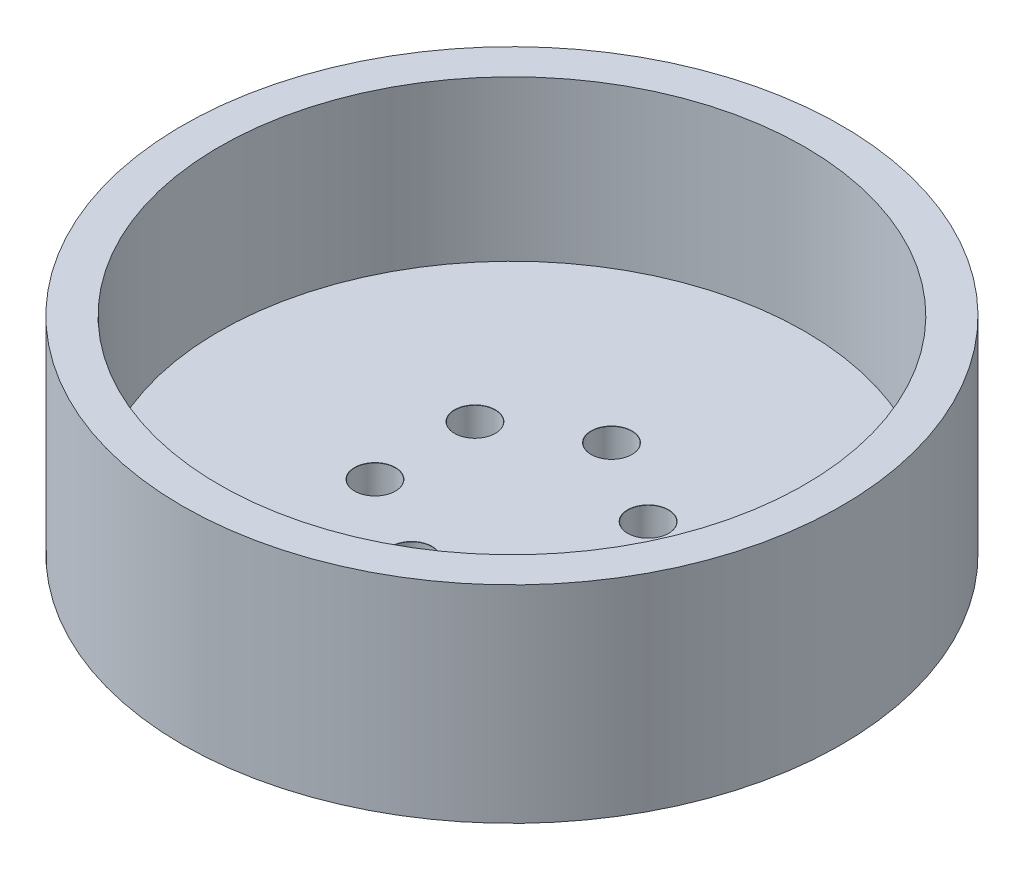
ISO-10303-21;
HEADER;
FILE_DESCRIPTION(('STEP AP214'),'2;1');
FILE_NAME('part.step','',(''),(''),'','','');
FILE_SCHEMA(('AUTOMOTIVE_DESIGN { 1 0 10303 214 1 1 1 1 }'));
ENDSEC;
DATA;
#1=APPLICATION_CONTEXT('core data for automotive mechanical design processes');
#2=APPLICATION_PROTOCOL_DEFINITION('international standard','automotive_design',2000,#1);
#3=PRODUCT_CONTEXT('',#1,'mechanical');
#4=PRODUCT('Part','Part','',(#3));
#5=PRODUCT_RELATED_PRODUCT_CATEGORY('part','',(#4));
#6=PRODUCT_DEFINITION_FORMATION('','',#4);
#7=PRODUCT_DEFINITION_CONTEXT('part definition',#1,'design');
#8=PRODUCT_DEFINITION('design','',#6,#7);
#9=PRODUCT_DEFINITION_SHAPE('','',#8);
#10=(LENGTH_UNIT() NAMED_UNIT(*) SI_UNIT(.MILLI.,.METRE.));
#11=(NAMED_UNIT(*) PLANE_ANGLE_UNIT() SI_UNIT($,.RADIAN.));
#12=(NAMED_UNIT(*) SI_UNIT($,.STERADIAN.) SOLID_ANGLE_UNIT());
#13=UNCERTAINTY_MEASURE_WITH_UNIT(LENGTH_MEASURE(1.E-05),#10,'distance_accuracy_value','');
#14=(GEOMETRIC_REPRESENTATION_CONTEXT(3) GLOBAL_UNCERTAINTY_ASSIGNED_CONTEXT((#13)) GLOBAL_UNIT_ASSIGNED_CONTEXT((#10,
#11,#12)) REPRESENTATION_CONTEXT('',''));
#15=CARTESIAN_POINT('',(0.,0.,0.));
#16=DIRECTION('',(0.,0.,1.));
#17=DIRECTION('',(1.,0.,0.));
#18=AXIS2_PLACEMENT_3D('',#15,#16,#17);
#19=CARTESIAN_POINT('',(0.,6.35,0.));
#20=DIRECTION('',(0.,-1.,0.));
#21=DIRECTION('',(0.,0.,-1.));
#22=AXIS2_PLACEMENT_3D('',#19,#20,#21);
#23=CYLINDRICAL_SURFACE('',#22,44.675);
#24=CARTESIAN_POINT('',(0.,0.,0.));
#25=DIRECTION('',(0.,1.,0.));
#26=DIRECTION('',(0.,0.,1.));
#27=AXIS2_PLACEMENT_3D('',#24,#25,#26);
#28=CIRCLE('',#27,44.675);
#29=CARTESIAN_POINT('',(0.,0.,44.675));
#30=VERTEX_POINT('',#29);
#31=EDGE_CURVE('E47',#30,#30,#28,.T.);
#32=ORIENTED_EDGE('',*,*,#31,.T.);
#33=EDGE_LOOP('',(#32));
#34=FACE_BOUND('',#33,.T.);
#35=CARTESIAN_POINT('',(0.,28.,0.));
#36=DIRECTION('',(0.,1.,0.));
#37=DIRECTION('',(0.,0.,1.));
#38=AXIS2_PLACEMENT_3D('',#35,#36,#37);
#39=CIRCLE('',#38,44.675);
#40=CARTESIAN_POINT('',(0.,28.,44.675));
#41=VERTEX_POINT('',#40);
#42=EDGE_CURVE('E108',#41,#41,#39,.T.);
#43=ORIENTED_EDGE('',*,*,#42,.F.);
#44=EDGE_LOOP('',(#43));
#45=FACE_BOUND('',#44,.T.);
#46=ADVANCED_FACE('F41',(#34,#45),#23,.T.);
#47=CARTESIAN_POINT('',(0.,6.35,0.));
#48=DIRECTION('',(0.,1.,0.));
#49=DIRECTION('',(0.,0.,1.));
#50=AXIS2_PLACEMENT_3D('',#47,#48,#49);
#51=PLANE('',#50);
#52=CARTESIAN_POINT('',(0.,6.35,0.));
#53=DIRECTION('',(0.,1.,0.));
#54=DIRECTION('',(0.,0.,1.));
#55=AXIS2_PLACEMENT_3D('',#52,#53,#54);
#56=CIRCLE('',#55,39.675);
#57=CARTESIAN_POINT('',(0.,6.35,-39.675));
#58=VERTEX_POINT('',#57);
#59=EDGE_CURVE('E10',#58,#58,#56,.F.);
#60=ORIENTED_EDGE('',*,*,#59,.F.);
#61=EDGE_LOOP('',(#60));
#62=FACE_BOUND('',#61,.T.);
#63=CARTESIAN_POINT('',(11.7366264666169,6.35,-6.72385555012073));
#64=DIRECTION('',(0.,1.,0.));
#65=DIRECTION('',(0.,0.,1.));
#66=AXIS2_PLACEMENT_3D('',#63,#64,#65);
#67=CIRCLE('',#66,2.775);
#68=CARTESIAN_POINT('',(11.7366264666169,6.35,-3.94885555012073));
#69=VERTEX_POINT('',#68);
#70=EDGE_CURVE('E105',#69,#69,#67,.T.);
#71=ORIENTED_EDGE('',*,*,#70,.F.);
#72=EDGE_LOOP('',(#71));
#73=FACE_BOUND('',#72,.T.);
#74=CARTESIAN_POINT('',(11.7366264666171,6.35,6.82843334963811));
#75=DIRECTION('',(0.,1.,0.));
#76=DIRECTION('',(0.,0.,1.));
#77=AXIS2_PLACEMENT_3D('',#74,#75,#76);
#78=CIRCLE('',#77,2.775);
#79=CARTESIAN_POINT('',(11.7366264666171,6.35,9.60343334963811));
#80=VERTEX_POINT('',#79);
#81=EDGE_CURVE('E96',#80,#80,#78,.T.);
#82=ORIENTED_EDGE('',*,*,#81,.F.);
#83=EDGE_LOOP('',(#82));
#84=FACE_BOUND('',#83,.T.);
#85=CARTESIAN_POINT('',(0.,6.35,13.6045777995176));
#86=DIRECTION('',(0.,1.,0.));
#87=DIRECTION('',(0.,0.,1.));
#88=AXIS2_PLACEMENT_3D('',#85,#86,#87);
#89=CIRCLE('',#88,2.775);
#90=CARTESIAN_POINT('',(0.,6.35,16.3795777995176));
#91=VERTEX_POINT('',#90);
#92=EDGE_CURVE('E87',#91,#91,#89,.T.);
#93=ORIENTED_EDGE('',*,*,#92,.F.);
#94=EDGE_LOOP('',(#93));
#95=FACE_BOUND('',#94,.T.);
#96=CARTESIAN_POINT('',(-11.736626466617,6.35,6.82843334963828));
#97=DIRECTION('',(0.,1.,0.));
#98=DIRECTION('',(0.,0.,1.));
#99=AXIS2_PLACEMENT_3D('',#96,#97,#98);
#100=CIRCLE('',#99,2.775);
#101=CARTESIAN_POINT('',(-11.736626466617,6.35,9.60343334963827));
#102=VERTEX_POINT('',#101);
#103=EDGE_CURVE('E78',#102,#102,#100,.T.);
#104=ORIENTED_EDGE('',*,*,#103,.F.);
#105=EDGE_LOOP('',(#104));
#106=FACE_BOUND('',#105,.T.);
#107=CARTESIAN_POINT('',(-11.736626466617,6.35,-6.72385555012057));
#108=DIRECTION('',(0.,1.,0.));
#109=DIRECTION('',(0.,0.,1.));
#110=AXIS2_PLACEMENT_3D('',#107,#108,#109);
#111=CIRCLE('',#110,2.775);
#112=CARTESIAN_POINT('',(-11.736626466617,6.35,-3.94885555012057));
#113=VERTEX_POINT('',#112);
#114=EDGE_CURVE('E69',#113,#113,#111,.T.);
#115=ORIENTED_EDGE('',*,*,#114,.F.);
#116=EDGE_LOOP('',(#115));
#117=FACE_BOUND('',#116,.T.);
#118=CARTESIAN_POINT('',(0.,6.35,-13.5));
#119=DIRECTION('',(0.,1.,0.));
#120=DIRECTION('',(0.,0.,1.));
#121=AXIS2_PLACEMENT_3D('',#118,#119,#120);
#122=CIRCLE('',#121,2.775);
#123=CARTESIAN_POINT('',(0.,6.35,-10.725));
#124=VERTEX_POINT('',#123);
#125=EDGE_CURVE('E60',#124,#124,#122,.T.);
#126=ORIENTED_EDGE('',*,*,#125,.F.);
#127=EDGE_LOOP('',(#126));
#128=FACE_BOUND('',#127,.T.);
#129=ADVANCED_FACE('F124',(#62,#73,#84,#95,#106,#117,#128),#51,.T.);
#130=CARTESIAN_POINT('',(0.,0.,0.));
#131=DIRECTION('',(0.,1.,0.));
#132=DIRECTION('',(0.,0.,1.));
#133=AXIS2_PLACEMENT_3D('',#130,#131,#132);
#134=PLANE('',#133);
#135=CARTESIAN_POINT('',(11.7366264666169,0.,-6.72385555012073));
#136=DIRECTION('',(0.,1.,0.));
#137=DIRECTION('',(0.,0.,1.));
#138=AXIS2_PLACEMENT_3D('',#135,#136,#137);
#139=CIRCLE('',#138,2.75);
#140=CARTESIAN_POINT('',(11.7366264666169,0.,-3.97385555012073));
#141=VERTEX_POINT('',#140);
#142=EDGE_CURVE('E99',#141,#141,#139,.T.);
#143=ORIENTED_EDGE('',*,*,#142,.T.);
#144=EDGE_LOOP('',(#143));
#145=FACE_BOUND('',#144,.T.);
#146=CARTESIAN_POINT('',(11.7366264666171,0.,6.82843334963811));
#147=DIRECTION('',(0.,1.,0.));
#148=DIRECTION('',(0.,0.,1.));
#149=AXIS2_PLACEMENT_3D('',#146,#147,#148);
#150=CIRCLE('',#149,2.75);
#151=CARTESIAN_POINT('',(11.7366264666171,0.,9.57843334963811));
#152=VERTEX_POINT('',#151);
#153=EDGE_CURVE('E90',#152,#152,#150,.T.);
#154=ORIENTED_EDGE('',*,*,#153,.T.);
#155=EDGE_LOOP('',(#154));
#156=FACE_BOUND('',#155,.T.);
#157=CARTESIAN_POINT('',(0.,0.,13.6045777995176));
#158=DIRECTION('',(0.,1.,0.));
#159=DIRECTION('',(0.,0.,1.));
#160=AXIS2_PLACEMENT_3D('',#157,#158,#159);
#161=CIRCLE('',#160,2.75);
#162=CARTESIAN_POINT('',(0.,0.,16.3545777995176));
#163=VERTEX_POINT('',#162);
#164=EDGE_CURVE('E81',#163,#163,#161,.T.);
#165=ORIENTED_EDGE('',*,*,#164,.T.);
#166=EDGE_LOOP('',(#165));
#167=FACE_BOUND('',#166,.T.);
#168=CARTESIAN_POINT('',(-11.736626466617,0.,6.82843334963828));
#169=DIRECTION('',(0.,1.,0.));
#170=DIRECTION('',(0.,0.,1.));
#171=AXIS2_PLACEMENT_3D('',#168,#169,#170);
#172=CIRCLE('',#171,2.75);
#173=CARTESIAN_POINT('',(-11.736626466617,0.,9.57843334963827));
#174=VERTEX_POINT('',#173);
#175=EDGE_CURVE('E72',#174,#174,#172,.T.);
#176=ORIENTED_EDGE('',*,*,#175,.T.);
#177=EDGE_LOOP('',(#176));
#178=FACE_BOUND('',#177,.T.);
#179=CARTESIAN_POINT('',(-11.736626466617,0.,-6.72385555012057));
#180=DIRECTION('',(0.,1.,0.));
#181=DIRECTION('',(0.,0.,1.));
#182=AXIS2_PLACEMENT_3D('',#179,#180,#181);
#183=CIRCLE('',#182,2.75);
#184=CARTESIAN_POINT('',(-11.736626466617,0.,-3.97385555012057));
#185=VERTEX_POINT('',#184);
#186=EDGE_CURVE('E63',#185,#185,#183,.T.);
#187=ORIENTED_EDGE('',*,*,#186,.T.);
#188=EDGE_LOOP('',(#187));
#189=FACE_BOUND('',#188,.T.);
#190=CARTESIAN_POINT('',(0.,0.,-13.5));
#191=DIRECTION('',(0.,1.,0.));
#192=DIRECTION('',(0.,0.,1.));
#193=AXIS2_PLACEMENT_3D('',#190,#191,#192);
#194=CIRCLE('',#193,2.75);
#195=CARTESIAN_POINT('',(0.,0.,-10.75));
#196=VERTEX_POINT('',#195);
#197=EDGE_CURVE('E51',#196,#196,#194,.T.);
#198=ORIENTED_EDGE('',*,*,#197,.T.);
#199=EDGE_LOOP('',(#198));
#200=FACE_BOUND('',#199,.T.);
#201=ORIENTED_EDGE('',*,*,#31,.F.);
#202=EDGE_LOOP('',(#201));
#203=FACE_BOUND('',#202,.T.);
#204=ADVANCED_FACE('F130',(#145,#156,#167,#178,#189,#200,#203),#134,.F.);
#205=CARTESIAN_POINT('',(0.,6.35,-13.5));
#206=DIRECTION('',(0.,1.,0.));
#207=DIRECTION('',(0.,0.,1.));
#208=AXIS2_PLACEMENT_3D('',#205,#206,#207);
#209=CYLINDRICAL_SURFACE('',#208,2.74999999999999);
#210=ORIENTED_EDGE('',*,*,#197,.F.);
#211=EDGE_LOOP('',(#210));
#212=FACE_BOUND('',#211,.T.);
#213=CARTESIAN_POINT('',(0.,6.325,-13.5));
#214=DIRECTION('',(0.,1.,0.));
#215=DIRECTION('',(0.,0.,1.));
#216=AXIS2_PLACEMENT_3D('',#213,#214,#215);
#217=CIRCLE('',#216,2.74999999999999);
#218=CARTESIAN_POINT('',(0.,6.325,-10.75));
#219=VERTEX_POINT('',#218);
#220=EDGE_CURVE('E55',#219,#219,#217,.T.);
#221=ORIENTED_EDGE('',*,*,#220,.T.);
#222=EDGE_LOOP('',(#221));
#223=FACE_BOUND('',#222,.T.);
#224=ADVANCED_FACE('F136',(#212,#223),#209,.F.);
#225=CARTESIAN_POINT('',(0.,6.35,-13.5));
#226=DIRECTION('',(0.,1.,0.));
#227=DIRECTION('',(0.,0.,1.));
#228=AXIS2_PLACEMENT_3D('',#225,#226,#227);
#229=CONICAL_SURFACE('',#228,2.775,0.785398163397691);
#230=ORIENTED_EDGE('',*,*,#220,.F.);
#231=EDGE_LOOP('',(#230));
#232=FACE_BOUND('',#231,.T.);
#233=ORIENTED_EDGE('',*,*,#125,.T.);
#234=EDGE_LOOP('',(#233));
#235=FACE_BOUND('',#234,.T.);
#236=ADVANCED_FACE('F142',(#232,#235),#229,.F.);
#237=CARTESIAN_POINT('',(-11.736626466617,6.35,-6.72385555012057));
#238=DIRECTION('',(0.,1.,0.));
#239=DIRECTION('',(0.,0.,1.));
#240=AXIS2_PLACEMENT_3D('',#237,#238,#239);
#241=CYLINDRICAL_SURFACE('',#240,2.74999999999999);
#242=ORIENTED_EDGE('',*,*,#186,.F.);
#243=EDGE_LOOP('',(#242));
#244=FACE_BOUND('',#243,.T.);
#245=CARTESIAN_POINT('',(-11.736626466617,6.325,-6.72385555012057));
#246=DIRECTION('',(0.,1.,0.));
#247=DIRECTION('',(0.,0.,1.));
#248=AXIS2_PLACEMENT_3D('',#245,#246,#247);
#249=CIRCLE('',#248,2.74999999999999);
#250=CARTESIAN_POINT('',(-11.736626466617,6.325,-3.97385555012058));
#251=VERTEX_POINT('',#250);
#252=EDGE_CURVE('E66',#251,#251,#249,.T.);
#253=ORIENTED_EDGE('',*,*,#252,.T.);
#254=EDGE_LOOP('',(#253));
#255=FACE_BOUND('',#254,.T.);
#256=ADVANCED_FACE('F146',(#244,#255),#241,.F.);
#257=CARTESIAN_POINT('',(-11.736626466617,6.35,-6.72385555012057));
#258=DIRECTION('',(0.,1.,0.));
#259=DIRECTION('',(0.,0.,1.));
#260=AXIS2_PLACEMENT_3D('',#257,#258,#259);
#261=CONICAL_SURFACE('',#260,2.775,0.785398163397691);
#262=ORIENTED_EDGE('',*,*,#252,.F.);
#263=EDGE_LOOP('',(#262));
#264=FACE_BOUND('',#263,.T.);
#265=ORIENTED_EDGE('',*,*,#114,.T.);
#266=EDGE_LOOP('',(#265));
#267=FACE_BOUND('',#266,.T.);
#268=ADVANCED_FACE('F150',(#264,#267),#261,.F.);
#269=CARTESIAN_POINT('',(-11.736626466617,6.35,6.82843334963828));
#270=DIRECTION('',(0.,1.,0.));
#271=DIRECTION('',(0.,0.,1.));
#272=AXIS2_PLACEMENT_3D('',#269,#270,#271);
#273=CYLINDRICAL_SURFACE('',#272,2.74999999999999);
#274=ORIENTED_EDGE('',*,*,#175,.F.);
#275=EDGE_LOOP('',(#274));
#276=FACE_BOUND('',#275,.T.);
#277=CARTESIAN_POINT('',(-11.736626466617,6.325,6.82843334963828));
#278=DIRECTION('',(0.,1.,0.));
#279=DIRECTION('',(0.,0.,1.));
#280=AXIS2_PLACEMENT_3D('',#277,#278,#279);
#281=CIRCLE('',#280,2.74999999999999);
#282=CARTESIAN_POINT('',(-11.736626466617,6.325,9.57843334963826));
#283=VERTEX_POINT('',#282);
#284=EDGE_CURVE('E75',#283,#283,#281,.T.);
#285=ORIENTED_EDGE('',*,*,#284,.T.);
#286=EDGE_LOOP('',(#285));
#287=FACE_BOUND('',#286,.T.);
#288=ADVANCED_FACE('F154',(#276,#287),#273,.F.);
#289=CARTESIAN_POINT('',(-11.736626466617,6.35,6.82843334963828));
#290=DIRECTION('',(0.,1.,0.));
#291=DIRECTION('',(0.,0.,1.));
#292=AXIS2_PLACEMENT_3D('',#289,#290,#291);
#293=CONICAL_SURFACE('',#292,2.775,0.785398163397691);
#294=ORIENTED_EDGE('',*,*,#284,.F.);
#295=EDGE_LOOP('',(#294));
#296=FACE_BOUND('',#295,.T.);
#297=ORIENTED_EDGE('',*,*,#103,.T.);
#298=EDGE_LOOP('',(#297));
#299=FACE_BOUND('',#298,.T.);
#300=ADVANCED_FACE('F158',(#296,#299),#293,.F.);
#301=CARTESIAN_POINT('',(0.,6.35,13.6045777995176));
#302=DIRECTION('',(0.,1.,0.));
#303=DIRECTION('',(0.,0.,1.));
#304=AXIS2_PLACEMENT_3D('',#301,#302,#303);
#305=CYLINDRICAL_SURFACE('',#304,2.74999999999999);
#306=ORIENTED_EDGE('',*,*,#164,.F.);
#307=EDGE_LOOP('',(#306));
#308=FACE_BOUND('',#307,.T.);
#309=CARTESIAN_POINT('',(0.,6.325,13.6045777995176));
#310=DIRECTION('',(0.,1.,0.));
#311=DIRECTION('',(0.,0.,1.));
#312=AXIS2_PLACEMENT_3D('',#309,#310,#311);
#313=CIRCLE('',#312,2.74999999999999);
#314=CARTESIAN_POINT('',(0.,6.325,16.3545777995176));
#315=VERTEX_POINT('',#314);
#316=EDGE_CURVE('E84',#315,#315,#313,.T.);
#317=ORIENTED_EDGE('',*,*,#316,.T.);
#318=EDGE_LOOP('',(#317));
#319=FACE_BOUND('',#318,.T.);
#320=ADVANCED_FACE('F162',(#308,#319),#305,.F.);
#321=CARTESIAN_POINT('',(0.,6.35,13.6045777995176));
#322=DIRECTION('',(0.,1.,0.));
#323=DIRECTION('',(0.,0.,1.));
#324=AXIS2_PLACEMENT_3D('',#321,#322,#323);
#325=CONICAL_SURFACE('',#324,2.775,0.785398163397691);
#326=ORIENTED_EDGE('',*,*,#316,.F.);
#327=EDGE_LOOP('',(#326));
#328=FACE_BOUND('',#327,.T.);
#329=ORIENTED_EDGE('',*,*,#92,.T.);
#330=EDGE_LOOP('',(#329));
#331=FACE_BOUND('',#330,.T.);
#332=ADVANCED_FACE('F166',(#328,#331),#325,.F.);
#333=CARTESIAN_POINT('',(11.7366264666171,6.35,6.82843334963811));
#334=DIRECTION('',(0.,1.,0.));
#335=DIRECTION('',(0.,0.,1.));
#336=AXIS2_PLACEMENT_3D('',#333,#334,#335);
#337=CYLINDRICAL_SURFACE('',#336,2.74999999999999);
#338=ORIENTED_EDGE('',*,*,#153,.F.);
#339=EDGE_LOOP('',(#338));
#340=FACE_BOUND('',#339,.T.);
#341=CARTESIAN_POINT('',(11.7366264666171,6.325,6.82843334963811));
#342=DIRECTION('',(0.,1.,0.));
#343=DIRECTION('',(0.,0.,1.));
#344=AXIS2_PLACEMENT_3D('',#341,#342,#343);
#345=CIRCLE('',#344,2.74999999999999);
#346=CARTESIAN_POINT('',(11.7366264666171,6.325,9.5784333496381));
#347=VERTEX_POINT('',#346);
#348=EDGE_CURVE('E93',#347,#347,#345,.T.);
#349=ORIENTED_EDGE('',*,*,#348,.T.);
#350=EDGE_LOOP('',(#349));
#351=FACE_BOUND('',#350,.T.);
#352=ADVANCED_FACE('F170',(#340,#351),#337,.F.);
#353=CARTESIAN_POINT('',(11.7366264666171,6.35,6.82843334963811));
#354=DIRECTION('',(0.,1.,0.));
#355=DIRECTION('',(0.,0.,1.));
#356=AXIS2_PLACEMENT_3D('',#353,#354,#355);
#357=CONICAL_SURFACE('',#356,2.775,0.785398163397691);
#358=ORIENTED_EDGE('',*,*,#348,.F.);
#359=EDGE_LOOP('',(#358));
#360=FACE_BOUND('',#359,.T.);
#361=ORIENTED_EDGE('',*,*,#81,.T.);
#362=EDGE_LOOP('',(#361));
#363=FACE_BOUND('',#362,.T.);
#364=ADVANCED_FACE('F174',(#360,#363),#357,.F.);
#365=CARTESIAN_POINT('',(11.7366264666169,6.35,-6.72385555012073));
#366=DIRECTION('',(0.,1.,0.));
#367=DIRECTION('',(0.,0.,1.));
#368=AXIS2_PLACEMENT_3D('',#365,#366,#367);
#369=CYLINDRICAL_SURFACE('',#368,2.74999999999999);
#370=ORIENTED_EDGE('',*,*,#142,.F.);
#371=EDGE_LOOP('',(#370));
#372=FACE_BOUND('',#371,.T.);
#373=CARTESIAN_POINT('',(11.7366264666169,6.325,-6.72385555012073));
#374=DIRECTION('',(0.,1.,0.));
#375=DIRECTION('',(0.,0.,1.));
#376=AXIS2_PLACEMENT_3D('',#373,#374,#375);
#377=CIRCLE('',#376,2.74999999999999);
#378=CARTESIAN_POINT('',(11.7366264666169,6.325,-3.97385555012074));
#379=VERTEX_POINT('',#378);
#380=EDGE_CURVE('E102',#379,#379,#377,.T.);
#381=ORIENTED_EDGE('',*,*,#380,.T.);
#382=EDGE_LOOP('',(#381));
#383=FACE_BOUND('',#382,.T.);
#384=ADVANCED_FACE('F178',(#372,#383),#369,.F.);
#385=CARTESIAN_POINT('',(11.7366264666169,6.35,-6.72385555012073));
#386=DIRECTION('',(0.,1.,0.));
#387=DIRECTION('',(0.,0.,1.));
#388=AXIS2_PLACEMENT_3D('',#385,#386,#387);
#389=CONICAL_SURFACE('',#388,2.775,0.785398163397691);
#390=ORIENTED_EDGE('',*,*,#380,.F.);
#391=EDGE_LOOP('',(#390));
#392=FACE_BOUND('',#391,.T.);
#393=ORIENTED_EDGE('',*,*,#70,.T.);
#394=EDGE_LOOP('',(#393));
#395=FACE_BOUND('',#394,.T.);
#396=ADVANCED_FACE('F181',(#392,#395),#389,.F.);
#397=CARTESIAN_POINT('',(0.,28.,0.));
#398=DIRECTION('',(0.,-1.,0.));
#399=DIRECTION('',(0.,0.,-1.));
#400=AXIS2_PLACEMENT_3D('',#397,#398,#399);
#401=CYLINDRICAL_SURFACE('',#400,39.675);
#402=CARTESIAN_POINT('',(0.,28.,0.));
#403=DIRECTION('',(0.,1.,0.));
#404=DIRECTION('',(0.,0.,1.));
#405=AXIS2_PLACEMENT_3D('',#402,#403,#404);
#406=CIRCLE('',#405,39.675);
#407=CARTESIAN_POINT('',(0.,28.,-39.675));
#408=VERTEX_POINT('',#407);
#409=EDGE_CURVE('E111',#408,#408,#406,.T.);
#410=CARTESIAN_POINT('',(0.,28.,-39.675));
#411=CARTESIAN_POINT('',(0.,27.7744791666667,-39.675));
#412=CARTESIAN_POINT('',(0.,27.5489583333333,-39.675));
#413=CARTESIAN_POINT('',(0.,27.0979166666667,-39.675));
#414=CARTESIAN_POINT('',(0.,26.8723958333333,-39.675));
#415=CARTESIAN_POINT('',(0.,26.4213541666667,-39.675));
#416=CARTESIAN_POINT('',(0.,26.1958333333333,-39.675));
#417=CARTESIAN_POINT('',(0.,25.7447916666667,-39.675));
#418=CARTESIAN_POINT('',(0.,25.5192708333333,-39.675));
#419=CARTESIAN_POINT('',(0.,25.0682291666667,-39.675));
#420=CARTESIAN_POINT('',(0.,24.8427083333333,-39.675));
#421=CARTESIAN_POINT('',(0.,24.3916666666667,-39.675));
#422=CARTESIAN_POINT('',(0.,24.1661458333333,-39.675));
#423=CARTESIAN_POINT('',(0.,23.7151041666667,-39.675));
#424=CARTESIAN_POINT('',(0.,23.4895833333333,-39.675));
#425=CARTESIAN_POINT('',(0.,23.0385416666667,-39.675));
#426=CARTESIAN_POINT('',(0.,22.8130208333333,-39.675));
#427=CARTESIAN_POINT('',(0.,22.3619791666667,-39.675));
#428=CARTESIAN_POINT('',(0.,22.1364583333333,-39.675));
#429=CARTESIAN_POINT('',(0.,21.6854166666667,-39.675));
#430=CARTESIAN_POINT('',(0.,21.4598958333333,-39.675));
#431=CARTESIAN_POINT('',(0.,21.0088541666667,-39.675));
#432=CARTESIAN_POINT('',(0.,20.7833333333333,-39.675));
#433=CARTESIAN_POINT('',(0.,20.3322916666667,-39.675));
#434=CARTESIAN_POINT('',(0.,20.1067708333333,-39.675));
#435=CARTESIAN_POINT('',(0.,19.6557291666667,-39.675));
#436=CARTESIAN_POINT('',(0.,19.4302083333333,-39.675));
#437=CARTESIAN_POINT('',(0.,18.9791666666667,-39.675));
#438=CARTESIAN_POINT('',(0.,18.7536458333333,-39.675));
#439=CARTESIAN_POINT('',(0.,18.3026041666667,-39.675));
#440=CARTESIAN_POINT('',(0.,18.0770833333333,-39.675));
#441=CARTESIAN_POINT('',(0.,17.6260416666667,-39.675));
#442=CARTESIAN_POINT('',(0.,17.4005208333333,-39.675));
#443=CARTESIAN_POINT('',(0.,16.9494791666667,-39.675));
#444=CARTESIAN_POINT('',(0.,16.7239583333333,-39.675));
#445=CARTESIAN_POINT('',(0.,16.2729166666667,-39.675));
#446=CARTESIAN_POINT('',(0.,16.0473958333333,-39.675));
#447=CARTESIAN_POINT('',(0.,15.5963541666667,-39.675));
#448=CARTESIAN_POINT('',(0.,15.3708333333333,-39.675));
#449=CARTESIAN_POINT('',(0.,14.9197916666667,-39.675));
#450=CARTESIAN_POINT('',(0.,14.6942708333333,-39.675));
#451=CARTESIAN_POINT('',(0.,14.2432291666667,-39.675));
#452=CARTESIAN_POINT('',(0.,14.0177083333333,-39.675));
#453=CARTESIAN_POINT('',(0.,13.5666666666667,-39.675));
#454=CARTESIAN_POINT('',(0.,13.3411458333333,-39.675));
#455=CARTESIAN_POINT('',(0.,12.8901041666667,-39.675));
#456=CARTESIAN_POINT('',(0.,12.6645833333333,-39.675));
#457=CARTESIAN_POINT('',(0.,12.2135416666667,-39.675));
#458=CARTESIAN_POINT('',(0.,11.9880208333333,-39.675));
#459=CARTESIAN_POINT('',(0.,11.5369791666667,-39.675));
#460=CARTESIAN_POINT('',(0.,11.3114583333333,-39.675));
#461=CARTESIAN_POINT('',(0.,10.8604166666667,-39.675));
#462=CARTESIAN_POINT('',(0.,10.6348958333333,-39.675));
#463=CARTESIAN_POINT('',(0.,10.1838541666667,-39.675));
#464=CARTESIAN_POINT('',(0.,9.95833333333333,-39.675));
#465=CARTESIAN_POINT('',(0.,9.50729166666666,-39.675));
#466=CARTESIAN_POINT('',(0.,9.28177083333333,-39.675));
#467=CARTESIAN_POINT('',(0.,8.83072916666667,-39.675));
#468=CARTESIAN_POINT('',(0.,8.60520833333333,-39.675));
#469=CARTESIAN_POINT('',(0.,8.15416666666667,-39.675));
#470=CARTESIAN_POINT('',(0.,7.92864583333333,-39.675));
#471=CARTESIAN_POINT('',(0.,7.47760416666666,-39.675));
#472=CARTESIAN_POINT('',(0.,7.25208333333333,-39.675));
#473=CARTESIAN_POINT('',(0.,6.80104166666666,-39.675));
#474=CARTESIAN_POINT('',(0.,6.57552083333333,-39.675));
#475=CARTESIAN_POINT('',(0.,6.35,-39.675));
#476=B_SPLINE_CURVE_WITH_KNOTS('',3,(#410,#411,#412,#413,#414,#415,#416,#417,#418,#419,#420,
#421,#422,#423,#424,#425,#426,#427,#428,#429,#430,#431,#432,#433,#434,#435,#436,#437,#438,#439,
#440,#441,#442,#443,#444,#445,#446,#447,#448,#449,#450,#451,#452,#453,#454,#455,#456,#457,#458,
#459,#460,#461,#462,#463,#464,#465,#466,#467,#468,#469,#470,#471,#472,#473,#474,#475),
.UNSPECIFIED.,.F.,.F.,(4,2,2,2,2,2,2,2,2,2,2,2,2,2,2,2,2,2,2,2,2,2,2,2,2,2,2,2,2,2,2,2,4),(0.,
0.676562500000002,1.353125,2.0296875,2.70625,3.3828125,4.059375,4.7359375,5.4125,6.0890625,
6.765625,7.4421875,8.11875,8.7953125,9.471875,10.1484375,10.825,11.5015625,12.178125,12.8546875,
13.53125,14.2078125,14.884375,15.5609375,16.2375,16.9140625,17.590625,18.2671875,18.94375,
19.6203125,20.296875,20.9734375,21.65),.UNSPECIFIED.);
#477=EDGE_CURVE('BSEAM115',#408,#58,#476,.T.);
#478=ORIENTED_EDGE('',*,*,#409,.T.);
#479=ORIENTED_EDGE('',*,*,#59,.T.);
#480=ORIENTED_EDGE('',*,*,#477,.T.);
#481=ORIENTED_EDGE('',*,*,#477,.F.);
#482=EDGE_LOOP('',(#478,#480,#479,#481));
#483=FACE_BOUND('',#482,.T.);
#484=ADVANCED_FACE('F115',(#483),#401,.F.);
#485=CARTESIAN_POINT('',(0.,28.,0.));
#486=DIRECTION('',(0.,1.,0.));
#487=DIRECTION('',(0.,0.,1.));
#488=AXIS2_PLACEMENT_3D('',#485,#486,#487);
#489=PLANE('',#488);
#490=ORIENTED_EDGE('',*,*,#409,.F.);
#491=EDGE_LOOP('',(#490));
#492=FACE_BOUND('',#491,.T.);
#493=ORIENTED_EDGE('',*,*,#42,.T.);
#494=EDGE_LOOP('',(#493));
#495=FACE_BOUND('',#494,.T.);
#496=ADVANCED_FACE('F117',(#492,#495),#489,.T.);
#497=CLOSED_SHELL('',(#46,#129,#204,#224,#236,#256,#268,#288,#300,#320,#332,#352,#364,#384,#396,
#484,#496));
#498=MANIFOLD_SOLID_BREP('B2',#497);
#499=ADVANCED_BREP_SHAPE_REPRESENTATION('',(#18,#498),#14);
#500=SHAPE_DEFINITION_REPRESENTATION(#9,#499);
ENDSEC;
END-ISO-10303-21;
